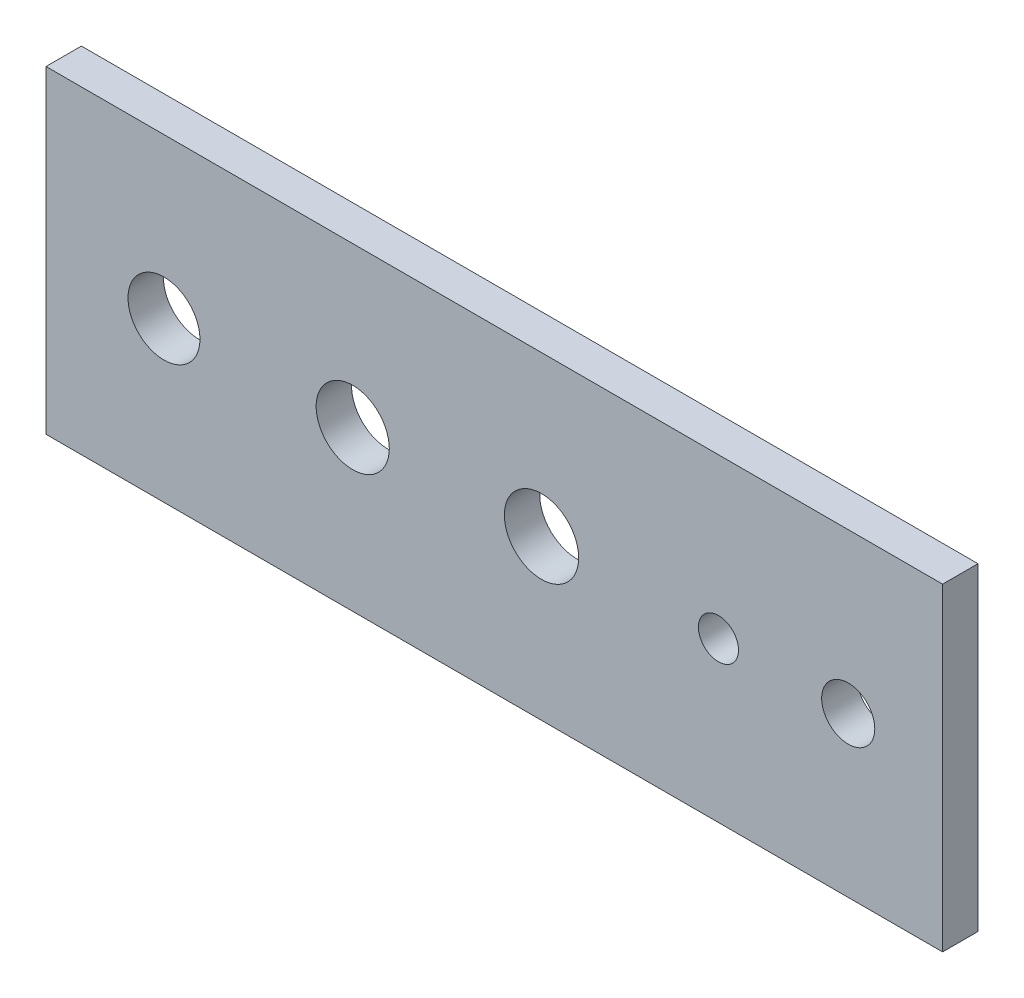
ISO-10303-21;
HEADER;
FILE_DESCRIPTION(('STEP AP214'),'2;1');
FILE_NAME('part.step','',(''),(''),'','','');
FILE_SCHEMA(('AUTOMOTIVE_DESIGN { 1 0 10303 214 1 1 1 1 }'));
ENDSEC;
DATA;
#1=APPLICATION_CONTEXT('core data for automotive mechanical design processes');
#2=APPLICATION_PROTOCOL_DEFINITION('international standard','automotive_design',2000,#1);
#3=PRODUCT_CONTEXT('',#1,'mechanical');
#4=PRODUCT('Part','Part','',(#3));
#5=PRODUCT_RELATED_PRODUCT_CATEGORY('part','',(#4));
#6=PRODUCT_DEFINITION_FORMATION('','',#4);
#7=PRODUCT_DEFINITION_CONTEXT('part definition',#1,'design');
#8=PRODUCT_DEFINITION('design','',#6,#7);
#9=PRODUCT_DEFINITION_SHAPE('','',#8);
#10=(LENGTH_UNIT() NAMED_UNIT(*) SI_UNIT(.MILLI.,.METRE.));
#11=(NAMED_UNIT(*) PLANE_ANGLE_UNIT() SI_UNIT($,.RADIAN.));
#12=(NAMED_UNIT(*) SI_UNIT($,.STERADIAN.) SOLID_ANGLE_UNIT());
#13=UNCERTAINTY_MEASURE_WITH_UNIT(LENGTH_MEASURE(1.E-05),#10,'distance_accuracy_value','');
#14=(GEOMETRIC_REPRESENTATION_CONTEXT(3) GLOBAL_UNCERTAINTY_ASSIGNED_CONTEXT((#13)) GLOBAL_UNIT_ASSIGNED_CONTEXT((#10,
#11,#12)) REPRESENTATION_CONTEXT('',''));
#15=CARTESIAN_POINT('',(0.,0.,0.));
#16=DIRECTION('',(0.,0.,1.));
#17=DIRECTION('',(1.,0.,0.));
#18=AXIS2_PLACEMENT_3D('',#15,#16,#17);
#19=CARTESIAN_POINT('',(68.,13.5,-1.));
#20=DIRECTION('',(0.,0.,1.));
#21=DIRECTION('',(1.,0.,0.));
#22=AXIS2_PLACEMENT_3D('',#19,#20,#21);
#23=CYLINDRICAL_SURFACE('',#22,2.25);
#24=DIRECTION('',(0.,0.,1.));
#25=VECTOR('',#24,1.);
#26=CARTESIAN_POINT('',(70.25,13.5,-1.));
#27=LINE('',#26,#25);
#28=CARTESIAN_POINT('',(70.25,13.5,0.));
#29=VERTEX_POINT('',#28);
#30=CARTESIAN_POINT('',(70.25,13.5,3.));
#31=VERTEX_POINT('',#30);
#32=EDGE_CURVE('E10',#29,#31,#27,.T.);
#33=ORIENTED_EDGE('',*,*,#32,.F.);
#34=CARTESIAN_POINT('',(68.,13.5,0.));
#35=DIRECTION('',(0.,0.,1.));
#36=DIRECTION('',(1.,0.,0.));
#37=AXIS2_PLACEMENT_3D('',#34,#35,#36);
#38=CIRCLE('',#37,2.25);
#39=EDGE_CURVE('E200',#29,#29,#38,.T.);
#40=ORIENTED_EDGE('',*,*,#39,.F.);
#41=ORIENTED_EDGE('',*,*,#32,.T.);
#42=CARTESIAN_POINT('',(68.,13.5,3.));
#43=DIRECTION('',(0.,0.,1.));
#44=DIRECTION('',(1.,0.,0.));
#45=AXIS2_PLACEMENT_3D('',#42,#43,#44);
#46=CIRCLE('',#45,2.25);
#47=EDGE_CURVE('E122',#31,#31,#46,.T.);
#48=ORIENTED_EDGE('',*,*,#47,.T.);
#49=EDGE_LOOP('',(#33,#40,#41,#48));
#50=FACE_BOUND('',#49,.T.);
#51=ADVANCED_FACE('F16',(#50),#23,.F.);
#52=CARTESIAN_POINT('',(57.,13.5,-1.));
#53=DIRECTION('',(0.,0.,1.));
#54=DIRECTION('',(1.,0.,0.));
#55=AXIS2_PLACEMENT_3D('',#52,#53,#54);
#56=CYLINDRICAL_SURFACE('',#55,1.7);
#57=DIRECTION('',(0.,0.,1.));
#58=VECTOR('',#57,1.);
#59=CARTESIAN_POINT('',(58.7,13.5,-1.));
#60=LINE('',#59,#58);
#61=CARTESIAN_POINT('',(58.7,13.5,0.));
#62=VERTEX_POINT('',#61);
#63=CARTESIAN_POINT('',(58.7,13.5,3.));
#64=VERTEX_POINT('',#63);
#65=EDGE_CURVE('E25',#62,#64,#60,.T.);
#66=ORIENTED_EDGE('',*,*,#65,.F.);
#67=CARTESIAN_POINT('',(57.,13.5,0.));
#68=DIRECTION('',(0.,0.,1.));
#69=DIRECTION('',(1.,0.,0.));
#70=AXIS2_PLACEMENT_3D('',#67,#68,#69);
#71=CIRCLE('',#70,1.7);
#72=EDGE_CURVE('E171',#62,#62,#71,.T.);
#73=ORIENTED_EDGE('',*,*,#72,.F.);
#74=ORIENTED_EDGE('',*,*,#65,.T.);
#75=CARTESIAN_POINT('',(57.,13.5,3.));
#76=DIRECTION('',(0.,0.,1.));
#77=DIRECTION('',(1.,0.,0.));
#78=AXIS2_PLACEMENT_3D('',#75,#76,#77);
#79=CIRCLE('',#78,1.7);
#80=EDGE_CURVE('E173',#64,#64,#79,.T.);
#81=ORIENTED_EDGE('',*,*,#80,.T.);
#82=EDGE_LOOP('',(#66,#73,#74,#81));
#83=FACE_BOUND('',#82,.T.);
#84=ADVANCED_FACE('F213',(#83),#56,.F.);
#85=CARTESIAN_POINT('',(42.,13.5,-1.));
#86=DIRECTION('',(0.,0.,1.));
#87=DIRECTION('',(1.,0.,0.));
#88=AXIS2_PLACEMENT_3D('',#85,#86,#87);
#89=CYLINDRICAL_SURFACE('',#88,3.15);
#90=DIRECTION('',(0.,0.,1.));
#91=VECTOR('',#90,1.);
#92=CARTESIAN_POINT('',(45.15,13.5,-1.));
#93=LINE('',#92,#91);
#94=CARTESIAN_POINT('',(45.15,13.5,0.));
#95=VERTEX_POINT('',#94);
#96=CARTESIAN_POINT('',(45.15,13.5,3.));
#97=VERTEX_POINT('',#96);
#98=EDGE_CURVE('E209',#95,#97,#93,.T.);
#99=ORIENTED_EDGE('',*,*,#98,.F.);
#100=CARTESIAN_POINT('',(42.,13.5,0.));
#101=DIRECTION('',(0.,0.,1.));
#102=DIRECTION('',(1.,0.,0.));
#103=AXIS2_PLACEMENT_3D('',#100,#101,#102);
#104=CIRCLE('',#103,3.15);
#105=EDGE_CURVE('E167',#95,#95,#104,.T.);
#106=ORIENTED_EDGE('',*,*,#105,.F.);
#107=ORIENTED_EDGE('',*,*,#98,.T.);
#108=CARTESIAN_POINT('',(42.,13.5,3.));
#109=DIRECTION('',(0.,0.,1.));
#110=DIRECTION('',(1.,0.,0.));
#111=AXIS2_PLACEMENT_3D('',#108,#109,#110);
#112=CIRCLE('',#111,3.15);
#113=EDGE_CURVE('E148',#97,#97,#112,.T.);
#114=ORIENTED_EDGE('',*,*,#113,.T.);
#115=EDGE_LOOP('',(#99,#106,#107,#114));
#116=FACE_BOUND('',#115,.T.);
#117=ADVANCED_FACE('F18',(#116),#89,.F.);
#118=CARTESIAN_POINT('',(26.,13.5,-1.));
#119=DIRECTION('',(0.,0.,1.));
#120=DIRECTION('',(1.,0.,0.));
#121=AXIS2_PLACEMENT_3D('',#118,#119,#120);
#122=CYLINDRICAL_SURFACE('',#121,3.1);
#123=DIRECTION('',(0.,0.,1.));
#124=VECTOR('',#123,1.);
#125=CARTESIAN_POINT('',(29.1,13.5,-1.));
#126=LINE('',#125,#124);
#127=CARTESIAN_POINT('',(29.1,13.5,0.));
#128=VERTEX_POINT('',#127);
#129=CARTESIAN_POINT('',(29.1,13.5,3.));
#130=VERTEX_POINT('',#129);
#131=EDGE_CURVE('E206',#128,#130,#126,.T.);
#132=ORIENTED_EDGE('',*,*,#131,.F.);
#133=CARTESIAN_POINT('',(26.,13.5,0.));
#134=DIRECTION('',(0.,0.,1.));
#135=DIRECTION('',(1.,0.,0.));
#136=AXIS2_PLACEMENT_3D('',#133,#134,#135);
#137=CIRCLE('',#136,3.1);
#138=EDGE_CURVE('E172',#128,#128,#137,.T.);
#139=ORIENTED_EDGE('',*,*,#138,.F.);
#140=ORIENTED_EDGE('',*,*,#131,.T.);
#141=CARTESIAN_POINT('',(26.,13.5,3.));
#142=DIRECTION('',(0.,0.,1.));
#143=DIRECTION('',(1.,0.,0.));
#144=AXIS2_PLACEMENT_3D('',#141,#142,#143);
#145=CIRCLE('',#144,3.1);
#146=EDGE_CURVE('E145',#130,#130,#145,.T.);
#147=ORIENTED_EDGE('',*,*,#146,.T.);
#148=EDGE_LOOP('',(#132,#139,#140,#147));
#149=FACE_BOUND('',#148,.T.);
#150=ADVANCED_FACE('F257',(#149),#122,.F.);
#151=CARTESIAN_POINT('',(10.,13.5,-1.));
#152=DIRECTION('',(0.,0.,1.));
#153=DIRECTION('',(1.,0.,0.));
#154=AXIS2_PLACEMENT_3D('',#151,#152,#153);
#155=CYLINDRICAL_SURFACE('',#154,3.05);
#156=DIRECTION('',(0.,0.,1.));
#157=VECTOR('',#156,1.);
#158=CARTESIAN_POINT('',(13.05,13.5,-1.));
#159=LINE('',#158,#157);
#160=CARTESIAN_POINT('',(13.05,13.5,0.));
#161=VERTEX_POINT('',#160);
#162=CARTESIAN_POINT('',(13.05,13.5,3.));
#163=VERTEX_POINT('',#162);
#164=EDGE_CURVE('E203',#161,#163,#159,.T.);
#165=ORIENTED_EDGE('',*,*,#164,.F.);
#166=CARTESIAN_POINT('',(10.,13.5,0.));
#167=DIRECTION('',(0.,0.,1.));
#168=DIRECTION('',(1.,0.,0.));
#169=AXIS2_PLACEMENT_3D('',#166,#167,#168);
#170=CIRCLE('',#169,3.05);
#171=EDGE_CURVE('E191',#161,#161,#170,.T.);
#172=ORIENTED_EDGE('',*,*,#171,.F.);
#173=ORIENTED_EDGE('',*,*,#164,.T.);
#174=CARTESIAN_POINT('',(10.,13.5,3.));
#175=DIRECTION('',(0.,0.,1.));
#176=DIRECTION('',(1.,0.,0.));
#177=AXIS2_PLACEMENT_3D('',#174,#175,#176);
#178=CIRCLE('',#177,3.05);
#179=EDGE_CURVE('E149',#163,#163,#178,.T.);
#180=ORIENTED_EDGE('',*,*,#179,.T.);
#181=EDGE_LOOP('',(#165,#172,#173,#180));
#182=FACE_BOUND('',#181,.T.);
#183=ADVANCED_FACE('F227',(#182),#155,.F.);
#184=CARTESIAN_POINT('',(76.,0.,0.));
#185=DIRECTION('',(1.,0.,0.));
#186=DIRECTION('',(0.,1.,0.));
#187=AXIS2_PLACEMENT_3D('',#184,#185,#186);
#188=PLANE('',#187);
#189=DIRECTION('',(0.,0.,1.));
#190=VECTOR('',#189,1.);
#191=CARTESIAN_POINT('',(76.,0.,0.));
#192=LINE('',#191,#190);
#193=CARTESIAN_POINT('',(76.,0.,0.));
#194=VERTEX_POINT('',#193);
#195=CARTESIAN_POINT('',(76.,0.,3.));
#196=VERTEX_POINT('',#195);
#197=EDGE_CURVE('E152',#194,#196,#192,.T.);
#198=ORIENTED_EDGE('',*,*,#197,.F.);
#199=DIRECTION('',(0.,1.,0.));
#200=VECTOR('',#199,1.);
#201=CARTESIAN_POINT('',(76.,0.,0.));
#202=LINE('',#201,#200);
#203=CARTESIAN_POINT('',(76.,27.,0.));
#204=VERTEX_POINT('',#203);
#205=EDGE_CURVE('E188',#194,#204,#202,.T.);
#206=ORIENTED_EDGE('',*,*,#205,.T.);
#207=DIRECTION('',(0.,0.,1.));
#208=VECTOR('',#207,1.);
#209=CARTESIAN_POINT('',(76.,27.,0.));
#210=LINE('',#209,#208);
#211=CARTESIAN_POINT('',(76.,27.,3.));
#212=VERTEX_POINT('',#211);
#213=EDGE_CURVE('E119',#204,#212,#210,.T.);
#214=ORIENTED_EDGE('',*,*,#213,.T.);
#215=DIRECTION('',(0.,1.,0.));
#216=VECTOR('',#215,1.);
#217=CARTESIAN_POINT('',(76.,0.,3.));
#218=LINE('',#217,#216);
#219=EDGE_CURVE('E162',#196,#212,#218,.T.);
#220=ORIENTED_EDGE('',*,*,#219,.F.);
#221=EDGE_LOOP('',(#198,#206,#214,#220));
#222=FACE_BOUND('',#221,.T.);
#223=ADVANCED_FACE('F218',(#222),#188,.T.);
#224=CARTESIAN_POINT('',(0.,0.,0.));
#225=DIRECTION('',(0.,0.,1.));
#226=DIRECTION('',(1.,0.,0.));
#227=AXIS2_PLACEMENT_3D('',#224,#225,#226);
#228=PLANE('',#227);
#229=ORIENTED_EDGE('',*,*,#39,.T.);
#230=EDGE_LOOP('',(#229));
#231=FACE_BOUND('',#230,.T.);
#232=ORIENTED_EDGE('',*,*,#72,.T.);
#233=EDGE_LOOP('',(#232));
#234=FACE_BOUND('',#233,.T.);
#235=ORIENTED_EDGE('',*,*,#105,.T.);
#236=EDGE_LOOP('',(#235));
#237=FACE_BOUND('',#236,.T.);
#238=ORIENTED_EDGE('',*,*,#138,.T.);
#239=EDGE_LOOP('',(#238));
#240=FACE_BOUND('',#239,.T.);
#241=ORIENTED_EDGE('',*,*,#171,.T.);
#242=EDGE_LOOP('',(#241));
#243=FACE_BOUND('',#242,.T.);
#244=DIRECTION('',(1.,0.,0.));
#245=VECTOR('',#244,1.);
#246=CARTESIAN_POINT('',(0.,27.,0.));
#247=LINE('',#246,#245);
#248=CARTESIAN_POINT('',(0.,27.,0.));
#249=VERTEX_POINT('',#248);
#250=EDGE_CURVE('E112',#249,#204,#247,.T.);
#251=ORIENTED_EDGE('',*,*,#250,.T.);
#252=ORIENTED_EDGE('',*,*,#205,.F.);
#253=DIRECTION('',(1.,0.,0.));
#254=VECTOR('',#253,1.);
#255=CARTESIAN_POINT('',(0.,0.,0.));
#256=LINE('',#255,#254);
#257=CARTESIAN_POINT('',(0.,0.,0.));
#258=VERTEX_POINT('',#257);
#259=EDGE_CURVE('E128',#258,#194,#256,.T.);
#260=ORIENTED_EDGE('',*,*,#259,.F.);
#261=DIRECTION('',(0.,1.,0.));
#262=VECTOR('',#261,1.);
#263=CARTESIAN_POINT('',(0.,0.,0.));
#264=LINE('',#263,#262);
#265=EDGE_CURVE('E125',#258,#249,#264,.T.);
#266=ORIENTED_EDGE('',*,*,#265,.T.);
#267=EDGE_LOOP('',(#251,#252,#260,#266));
#268=FACE_BOUND('',#267,.T.);
#269=ADVANCED_FACE('F126',(#231,#234,#237,#240,#243,#268),#228,.F.);
#270=CARTESIAN_POINT('',(0.,27.,0.));
#271=DIRECTION('',(0.,1.,0.));
#272=DIRECTION('',(1.,0.,0.));
#273=AXIS2_PLACEMENT_3D('',#270,#271,#272);
#274=PLANE('',#273);
#275=ORIENTED_EDGE('',*,*,#250,.F.);
#276=DIRECTION('',(0.,0.,1.));
#277=VECTOR('',#276,1.);
#278=CARTESIAN_POINT('',(0.,27.,0.));
#279=LINE('',#278,#277);
#280=CARTESIAN_POINT('',(0.,27.,3.));
#281=VERTEX_POINT('',#280);
#282=EDGE_CURVE('E117',#249,#281,#279,.T.);
#283=ORIENTED_EDGE('',*,*,#282,.T.);
#284=DIRECTION('',(1.,0.,0.));
#285=VECTOR('',#284,1.);
#286=CARTESIAN_POINT('',(0.,27.,3.));
#287=LINE('',#286,#285);
#288=EDGE_CURVE('E166',#281,#212,#287,.T.);
#289=ORIENTED_EDGE('',*,*,#288,.T.);
#290=ORIENTED_EDGE('',*,*,#213,.F.);
#291=EDGE_LOOP('',(#275,#283,#289,#290));
#292=FACE_BOUND('',#291,.T.);
#293=ADVANCED_FACE('F114',(#292),#274,.T.);
#294=CARTESIAN_POINT('',(0.,0.,3.));
#295=DIRECTION('',(0.,0.,1.));
#296=DIRECTION('',(1.,0.,0.));
#297=AXIS2_PLACEMENT_3D('',#294,#295,#296);
#298=PLANE('',#297);
#299=ORIENTED_EDGE('',*,*,#47,.F.);
#300=EDGE_LOOP('',(#299));
#301=FACE_BOUND('',#300,.T.);
#302=ORIENTED_EDGE('',*,*,#80,.F.);
#303=EDGE_LOOP('',(#302));
#304=FACE_BOUND('',#303,.T.);
#305=ORIENTED_EDGE('',*,*,#113,.F.);
#306=EDGE_LOOP('',(#305));
#307=FACE_BOUND('',#306,.T.);
#308=ORIENTED_EDGE('',*,*,#146,.F.);
#309=EDGE_LOOP('',(#308));
#310=FACE_BOUND('',#309,.T.);
#311=ORIENTED_EDGE('',*,*,#179,.F.);
#312=EDGE_LOOP('',(#311));
#313=FACE_BOUND('',#312,.T.);
#314=DIRECTION('',(0.,1.,0.));
#315=VECTOR('',#314,1.);
#316=CARTESIAN_POINT('',(0.,0.,3.));
#317=LINE('',#316,#315);
#318=CARTESIAN_POINT('',(0.,0.,3.));
#319=VERTEX_POINT('',#318);
#320=EDGE_CURVE('E137',#319,#281,#317,.T.);
#321=ORIENTED_EDGE('',*,*,#320,.F.);
#322=DIRECTION('',(1.,0.,0.));
#323=VECTOR('',#322,1.);
#324=CARTESIAN_POINT('',(0.,0.,3.));
#325=LINE('',#324,#323);
#326=EDGE_CURVE('E153',#319,#196,#325,.T.);
#327=ORIENTED_EDGE('',*,*,#326,.T.);
#328=ORIENTED_EDGE('',*,*,#219,.T.);
#329=ORIENTED_EDGE('',*,*,#288,.F.);
#330=EDGE_LOOP('',(#321,#327,#328,#329));
#331=FACE_BOUND('',#330,.T.);
#332=ADVANCED_FACE('F230',(#301,#304,#307,#310,#313,#331),#298,.T.);
#333=CARTESIAN_POINT('',(0.,0.,0.));
#334=DIRECTION('',(0.,1.,0.));
#335=DIRECTION('',(1.,0.,0.));
#336=AXIS2_PLACEMENT_3D('',#333,#334,#335);
#337=PLANE('',#336);
#338=ORIENTED_EDGE('',*,*,#197,.T.);
#339=ORIENTED_EDGE('',*,*,#326,.F.);
#340=DIRECTION('',(0.,0.,1.));
#341=VECTOR('',#340,1.);
#342=CARTESIAN_POINT('',(0.,0.,0.));
#343=LINE('',#342,#341);
#344=EDGE_CURVE('E133',#258,#319,#343,.T.);
#345=ORIENTED_EDGE('',*,*,#344,.F.);
#346=ORIENTED_EDGE('',*,*,#259,.T.);
#347=EDGE_LOOP('',(#338,#339,#345,#346));
#348=FACE_BOUND('',#347,.T.);
#349=ADVANCED_FACE('F233',(#348),#337,.F.);
#350=CARTESIAN_POINT('',(0.,0.,0.));
#351=DIRECTION('',(1.,0.,0.));
#352=DIRECTION('',(0.,1.,0.));
#353=AXIS2_PLACEMENT_3D('',#350,#351,#352);
#354=PLANE('',#353);
#355=ORIENTED_EDGE('',*,*,#320,.T.);
#356=ORIENTED_EDGE('',*,*,#282,.F.);
#357=ORIENTED_EDGE('',*,*,#265,.F.);
#358=ORIENTED_EDGE('',*,*,#344,.T.);
#359=EDGE_LOOP('',(#355,#356,#357,#358));
#360=FACE_BOUND('',#359,.T.);
#361=ADVANCED_FACE('F135',(#360),#354,.F.);
#362=CLOSED_SHELL('',(#51,#84,#117,#150,#183,#223,#269,#293,#332,#349,#361));
#363=MANIFOLD_SOLID_BREP('B1',#362);
#364=ADVANCED_BREP_SHAPE_REPRESENTATION('',(#18,#363),#14);
#365=SHAPE_DEFINITION_REPRESENTATION(#9,#364);
ENDSEC;
END-ISO-10303-21;
